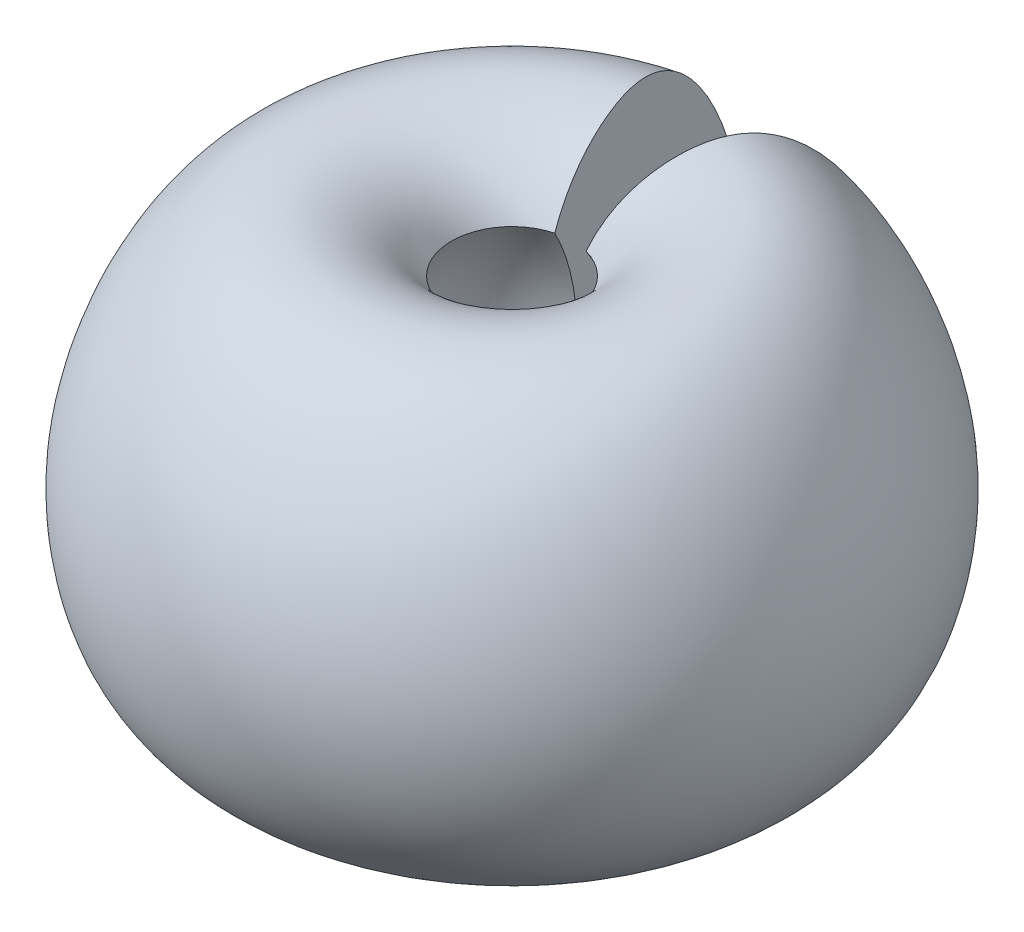
ISO-10303-21;
HEADER;
FILE_DESCRIPTION(('STEP AP214'),'2;1');
FILE_NAME('part.step','',(''),(''),'','','');
FILE_SCHEMA(('AUTOMOTIVE_DESIGN { 1 0 10303 214 1 1 1 1 }'));
ENDSEC;
DATA;
#1=APPLICATION_CONTEXT('core data for automotive mechanical design processes');
#2=APPLICATION_PROTOCOL_DEFINITION('international standard','automotive_design',2000,#1);
#3=PRODUCT_CONTEXT('',#1,'mechanical');
#4=PRODUCT('Part','Part','',(#3));
#5=PRODUCT_RELATED_PRODUCT_CATEGORY('part','',(#4));
#6=PRODUCT_DEFINITION_FORMATION('','',#4);
#7=PRODUCT_DEFINITION_CONTEXT('part definition',#1,'design');
#8=PRODUCT_DEFINITION('design','',#6,#7);
#9=PRODUCT_DEFINITION_SHAPE('','',#8);
#10=(LENGTH_UNIT() NAMED_UNIT(*) SI_UNIT(.MILLI.,.METRE.));
#11=(NAMED_UNIT(*) PLANE_ANGLE_UNIT() SI_UNIT($,.RADIAN.));
#12=(NAMED_UNIT(*) SI_UNIT($,.STERADIAN.) SOLID_ANGLE_UNIT());
#13=UNCERTAINTY_MEASURE_WITH_UNIT(LENGTH_MEASURE(1.E-05),#10,'distance_accuracy_value','');
#14=(GEOMETRIC_REPRESENTATION_CONTEXT(3) GLOBAL_UNCERTAINTY_ASSIGNED_CONTEXT((#13)) GLOBAL_UNIT_ASSIGNED_CONTEXT((#10,
#11,#12)) REPRESENTATION_CONTEXT('',''));
#15=CARTESIAN_POINT('',(0.,0.,0.));
#16=DIRECTION('',(0.,0.,1.));
#17=DIRECTION('',(1.,0.,0.));
#18=AXIS2_PLACEMENT_3D('',#15,#16,#17);
#19=CARTESIAN_POINT('',(222.32555974306,2559.,-829.730284782311));
#20=CARTESIAN_POINT('',(302.496016857,3110.590381493,-1128.93050399756));
#21=CARTESIAN_POINT('',(505.498943588916,3467.41932147496,-1886.54774064628));
#22=CARTESIAN_POINT('',(946.004464187587,3280.96510205542,-3530.53672453514));
#23=CARTESIAN_POINT('',(1224.09500025666,1125.15764648647,-4568.38473424901));
#24=CARTESIAN_POINT('',(1193.27467943014,-2994.45307895503,-4453.36173101887));
#25=CARTESIAN_POINT('',(474.053789018443,-3259.97762274443,-1769.19282613741));
#26=CARTESIAN_POINT('',(109.911833860131,-2211.08365738703,-410.196548319088));
#27=B_SPLINE_CURVE_WITH_KNOTS('',3,(#19,#20,#21,#22,#23,#24,#25,#26),.UNSPECIFIED.,.F.,.F.,(4,1,
1,1,1,4),(0.,0.0880867307275266,0.126076975316449,0.351699615825586,0.421493246089951,1.),.UNSPECIFIED.);
#28=CARTESIAN_POINT('',(0.,0.,0.));
#29=DIRECTION('',(0.,-1.,0.));
#30=AXIS1_PLACEMENT('',#28,#29);
#31=SURFACE_OF_REVOLUTION('',#27,#30);
#32=CARTESIAN_POINT('',(0.,2559.,0.));
#33=DIRECTION('',(0.,-1.,0.));
#34=DIRECTION('',(0.,0.,-1.));
#35=AXIS2_PLACEMENT_3D('',#32,#33,#34);
#36=CIRCLE('',#35,859.);
#37=CARTESIAN_POINT('',(222.32555974306,2559.,-829.730284782312));
#38=VERTEX_POINT('',#37);
#39=CARTESIAN_POINT('',(-222.32555974306,2559.,-829.730284782312));
#40=VERTEX_POINT('',#39);
#41=EDGE_CURVE('E11',#38,#40,#36,.T.);
#42=ORIENTED_EDGE('',*,*,#41,.T.);
#43=CARTESIAN_POINT('',(-222.32555974306,2559.,-829.730284782311));
#44=CARTESIAN_POINT('',(-302.496016857,3110.590381493,-1128.93050399756));
#45=CARTESIAN_POINT('',(-505.498943588916,3467.41932147496,-1886.54774064628));
#46=CARTESIAN_POINT('',(-946.004464187587,3280.96510205542,-3530.53672453514));
#47=CARTESIAN_POINT('',(-1224.09500025666,1125.15764648647,-4568.38473424901));
#48=CARTESIAN_POINT('',(-1193.27467943014,-2994.45307895503,-4453.36173101887));
#49=CARTESIAN_POINT('',(-474.053789018443,-3259.97762274443,-1769.19282613741));
#50=CARTESIAN_POINT('',(-109.911833860131,-2211.08365738703,-410.196548319088));
#51=B_SPLINE_CURVE_WITH_KNOTS('',3,(#43,#44,#45,#46,#47,#48,#49,#50),.UNSPECIFIED.,.F.,.F.,(4,1,
1,1,1,4),(0.,0.0880867307275266,0.126076975316449,0.351699615825586,0.421493246089951,1.),.UNSPECIFIED.);
#52=CARTESIAN_POINT('',(-109.911833860131,-2211.08365738703,-410.196548319089));
#53=VERTEX_POINT('',#52);
#54=EDGE_CURVE('E95',#40,#53,#51,.T.);
#55=ORIENTED_EDGE('',*,*,#54,.T.);
#56=CARTESIAN_POINT('',(0.,-2211.08365738703,0.));
#57=DIRECTION('',(0.,-1.,0.));
#58=DIRECTION('',(0.,0.,-1.));
#59=AXIS2_PLACEMENT_3D('',#56,#57,#58);
#60=CIRCLE('',#59,424.666715761186);
#61=CARTESIAN_POINT('',(109.911833860131,-2211.08365738703,-410.196548319089));
#62=VERTEX_POINT('',#61);
#63=EDGE_CURVE('E77',#62,#53,#60,.T.);
#64=ORIENTED_EDGE('',*,*,#63,.F.);
#65=EDGE_CURVE('E108',#38,#62,#27,.T.);
#66=ORIENTED_EDGE('',*,*,#65,.F.);
#67=EDGE_LOOP('',(#42,#55,#64,#66));
#68=FACE_BOUND('',#67,.T.);
#69=ADVANCED_FACE('F37',(#68),#31,.T.);
#70=CARTESIAN_POINT('',(0.,983.858142726205,0.));
#71=DIRECTION('',(0.,-1.,0.));
#72=DIRECTION('',(0.,0.,-1.));
#73=AXIS2_PLACEMENT_3D('',#70,#71,#72);
#74=DEGENERATE_TOROIDAL_SURFACE('',#73,1656.18406817428,2967.69654232599,.F.);
#75=CARTESIAN_POINT('',(0.,1000.,0.));
#76=DIRECTION('',(0.,-1.,0.));
#77=DIRECTION('',(0.,0.,-1.));
#78=AXIS2_PLACEMENT_3D('',#75,#76,#77);
#79=CIRCLE('',#78,1311.46857453467);
#80=CARTESIAN_POINT('',(339.433044143019,1000.,-1266.78136650955));
#81=VERTEX_POINT('',#80);
#82=CARTESIAN_POINT('',(-339.433044143019,1000.,-1266.78136650955));
#83=VERTEX_POINT('',#82);
#84=EDGE_CURVE('E45',#81,#83,#79,.T.);
#85=ORIENTED_EDGE('',*,*,#84,.T.);
#86=CARTESIAN_POINT('',(428.651979038864,983.858142726205,1599.75096453803));
#87=DIRECTION('',(0.96592582628907,0.,-0.258819045102515));
#88=DIRECTION('',(0.258819045102515,0.,0.96592582628907));
#89=AXIS2_PLACEMENT_3D('',#86,#87,#88);
#90=CIRCLE('',#89,2967.69654232599);
#91=EDGE_CURVE('E106',#83,#40,#90,.T.);
#92=ORIENTED_EDGE('',*,*,#91,.T.);
#93=ORIENTED_EDGE('',*,*,#41,.F.);
#94=CARTESIAN_POINT('',(-428.651979038864,983.858142726205,1599.75096453803));
#95=DIRECTION('',(0.96592582628907,0.,0.258819045102515));
#96=DIRECTION('',(-0.258819045102515,0.,0.96592582628907));
#97=AXIS2_PLACEMENT_3D('',#94,#95,#96);
#98=CIRCLE('',#97,2967.69654232599);
#99=EDGE_CURVE('E89',#81,#38,#98,.T.);
#100=ORIENTED_EDGE('',*,*,#99,.F.);
#101=EDGE_LOOP('',(#85,#92,#93,#100));
#102=FACE_BOUND('',#101,.T.);
#103=ADVANCED_FACE('F39',(#102),#74,.T.);
#104=CARTESIAN_POINT('',(0.,234.183909702288,0.));
#105=DIRECTION('',(0.,-1.,0.));
#106=DIRECTION('',(0.,0.,-1.));
#107=AXIS2_PLACEMENT_3D('',#104,#105,#106);
#108=DEGENERATE_TOROIDAL_SURFACE('',#107,311.811671576855,1259.28082959683,.T.);
#109=CARTESIAN_POINT('',(0.,-900.,0.));
#110=DIRECTION('',(0.,-1.,0.));
#111=DIRECTION('',(0.,0.,-1.));
#112=AXIS2_PLACEMENT_3D('',#109,#110,#111);
#113=CIRCLE('',#112,859.);
#114=CARTESIAN_POINT('',(222.32555974306,-900.,-829.730284782311));
#115=VERTEX_POINT('',#114);
#116=CARTESIAN_POINT('',(-222.32555974306,-900.,-829.730284782311));
#117=VERTEX_POINT('',#116);
#118=EDGE_CURVE('E88',#115,#117,#113,.T.);
#119=ORIENTED_EDGE('',*,*,#118,.T.);
#120=CARTESIAN_POINT('',(-80.7027990893405,234.183909702288,-301.18694651445));
#121=DIRECTION('',(0.96592582628907,0.,-0.258819045102515));
#122=DIRECTION('',(0.258819045102515,0.,0.96592582628907));
#123=AXIS2_PLACEMENT_3D('',#120,#121,#122);
#124=CIRCLE('',#123,1259.28082959683);
#125=EDGE_CURVE('E96',#117,#83,#124,.T.);
#126=ORIENTED_EDGE('',*,*,#125,.T.);
#127=ORIENTED_EDGE('',*,*,#84,.F.);
#128=CARTESIAN_POINT('',(80.7027990893405,234.183909702288,-301.18694651445));
#129=DIRECTION('',(0.96592582628907,0.,0.258819045102515));
#130=DIRECTION('',(-0.258819045102515,0.,0.96592582628907));
#131=AXIS2_PLACEMENT_3D('',#128,#129,#130);
#132=CIRCLE('',#131,1259.28082959683);
#133=EDGE_CURVE('E129',#115,#81,#132,.T.);
#134=ORIENTED_EDGE('',*,*,#133,.F.);
#135=EDGE_LOOP('',(#119,#126,#127,#134));
#136=FACE_BOUND('',#135,.T.);
#137=ADVANCED_FACE('F124',(#136),#108,.F.);
#138=CARTESIAN_POINT('',(0.,-1018.49047902138,0.));
#139=DIRECTION('',(0.,-1.,0.));
#140=DIRECTION('',(0.,0.,-1.));
#141=AXIS2_PLACEMENT_3D('',#138,#139,#140);
#142=DEGENERATE_TOROIDAL_SURFACE('',#141,979.316282922985,1842.13103488283,.F.);
#143=CARTESIAN_POINT('',(-253.465705199471,-1018.49047902138,945.946889780725));
#144=DIRECTION('',(0.96592582628907,0.,0.258819045102515));
#145=DIRECTION('',(-0.258819045102515,0.,0.96592582628907));
#146=AXIS2_PLACEMENT_3D('',#143,#144,#145);
#147=CIRCLE('',#146,1842.13103488283);
#148=EDGE_CURVE('E83',#62,#115,#147,.T.);
#149=ORIENTED_EDGE('',*,*,#148,.F.);
#150=ORIENTED_EDGE('',*,*,#63,.T.);
#151=CARTESIAN_POINT('',(253.465705199471,-1018.49047902138,945.946889780725));
#152=DIRECTION('',(0.96592582628907,0.,-0.258819045102515));
#153=DIRECTION('',(0.258819045102515,0.,0.96592582628907));
#154=AXIS2_PLACEMENT_3D('',#151,#152,#153);
#155=CIRCLE('',#154,1842.13103488283);
#156=EDGE_CURVE('E80',#53,#117,#155,.T.);
#157=ORIENTED_EDGE('',*,*,#156,.T.);
#158=ORIENTED_EDGE('',*,*,#118,.F.);
#159=EDGE_LOOP('',(#149,#150,#157,#158));
#160=FACE_BOUND('',#159,.T.);
#161=ADVANCED_FACE('F79',(#160),#142,.T.);
#162=CARTESIAN_POINT('',(1139.04866757345,-1444.73833900997,-4250.98749967785));
#163=DIRECTION('',(0.96592582628907,0.,0.258819045102515));
#164=DIRECTION('',(0.258819045102515,0.,-0.96592582628907));
#165=AXIS2_PLACEMENT_3D('',#162,#163,#164);
#166=PLANE('',#165);
#167=ORIENTED_EDGE('',*,*,#65,.T.);
#168=ORIENTED_EDGE('',*,*,#148,.T.);
#169=ORIENTED_EDGE('',*,*,#133,.T.);
#170=ORIENTED_EDGE('',*,*,#99,.T.);
#171=EDGE_LOOP('',(#167,#168,#169,#170));
#172=FACE_BOUND('',#171,.T.);
#173=ADVANCED_FACE('F121',(#172),#166,.F.);
#174=CARTESIAN_POINT('',(-1139.04866757345,-1444.73833900997,-4250.98749967785));
#175=DIRECTION('',(0.96592582628907,0.,-0.258819045102515));
#176=DIRECTION('',(-0.258819045102515,0.,-0.96592582628907));
#177=AXIS2_PLACEMENT_3D('',#174,#175,#176);
#178=PLANE('',#177);
#179=ORIENTED_EDGE('',*,*,#54,.F.);
#180=ORIENTED_EDGE('',*,*,#91,.F.);
#181=ORIENTED_EDGE('',*,*,#125,.F.);
#182=ORIENTED_EDGE('',*,*,#156,.F.);
#183=EDGE_LOOP('',(#179,#180,#181,#182));
#184=FACE_BOUND('',#183,.T.);
#185=ADVANCED_FACE('F93',(#184),#178,.T.);
#186=CLOSED_SHELL('',(#69,#103,#137,#161,#173,#185));
#187=MANIFOLD_SOLID_BREP('B2',#186);
#188=ADVANCED_BREP_SHAPE_REPRESENTATION('',(#18,#187),#14);
#189=SHAPE_DEFINITION_REPRESENTATION(#9,#188);
ENDSEC;
END-ISO-10303-21;
